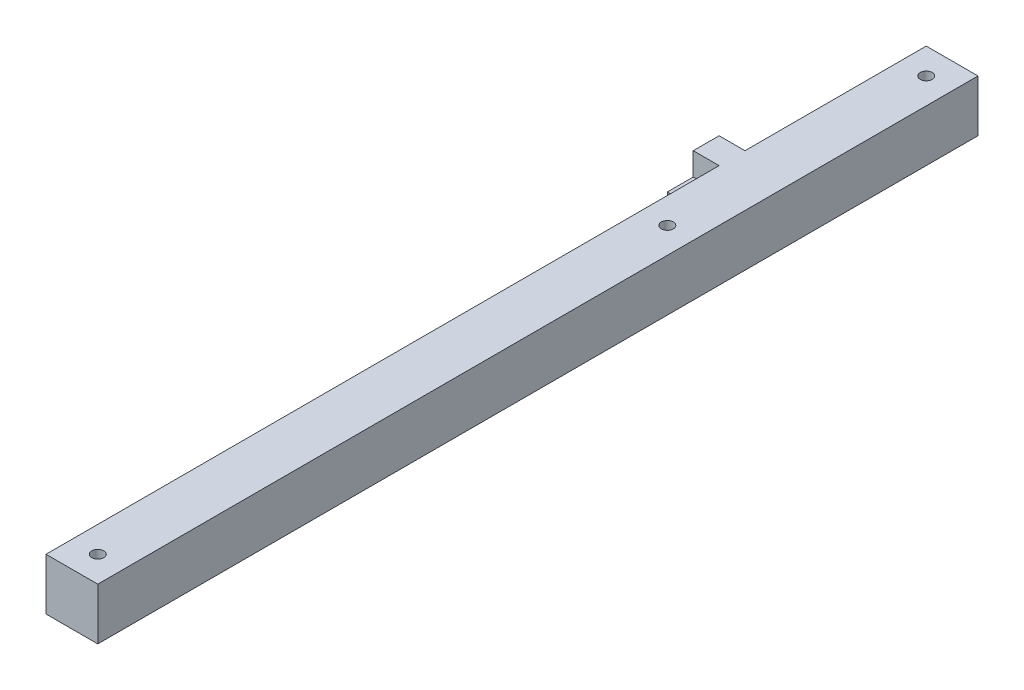
ISO-10303-21;
HEADER;
FILE_DESCRIPTION(('STEP AP214'),'2;1');
FILE_NAME('part.step','',(''),(''),'','','');
FILE_SCHEMA(('AUTOMOTIVE_DESIGN { 1 0 10303 214 1 1 1 1 }'));
ENDSEC;
DATA;
#1=APPLICATION_CONTEXT('core data for automotive mechanical design processes');
#2=APPLICATION_PROTOCOL_DEFINITION('international standard','automotive_design',2000,#1);
#3=PRODUCT_CONTEXT('',#1,'mechanical');
#4=PRODUCT('Part','Part','',(#3));
#5=PRODUCT_RELATED_PRODUCT_CATEGORY('part','',(#4));
#6=PRODUCT_DEFINITION_FORMATION('','',#4);
#7=PRODUCT_DEFINITION_CONTEXT('part definition',#1,'design');
#8=PRODUCT_DEFINITION('design','',#6,#7);
#9=PRODUCT_DEFINITION_SHAPE('','',#8);
#10=(LENGTH_UNIT() NAMED_UNIT(*) SI_UNIT(.MILLI.,.METRE.));
#11=(NAMED_UNIT(*) PLANE_ANGLE_UNIT() SI_UNIT($,.RADIAN.));
#12=(NAMED_UNIT(*) SI_UNIT($,.STERADIAN.) SOLID_ANGLE_UNIT());
#13=UNCERTAINTY_MEASURE_WITH_UNIT(LENGTH_MEASURE(1.E-05),#10,'distance_accuracy_value','');
#14=(GEOMETRIC_REPRESENTATION_CONTEXT(3) GLOBAL_UNCERTAINTY_ASSIGNED_CONTEXT((#13)) GLOBAL_UNIT_ASSIGNED_CONTEXT((#10,
#11,#12)) REPRESENTATION_CONTEXT('',''));
#15=CARTESIAN_POINT('',(0.,0.,0.));
#16=DIRECTION('',(0.,0.,1.));
#17=DIRECTION('',(1.,0.,0.));
#18=AXIS2_PLACEMENT_3D('',#15,#16,#17);
#19=CARTESIAN_POINT('',(-12.7,12.7,12.7));
#20=DIRECTION('',(1.,0.,0.));
#21=DIRECTION('',(0.,0.,-1.));
#22=AXIS2_PLACEMENT_3D('',#19,#20,#21);
#23=PLANE('',#22);
#24=DIRECTION('',(0.,1.,0.));
#25=VECTOR('',#24,1.);
#26=CARTESIAN_POINT('',(-12.7,0.,-146.05));
#27=LINE('',#26,#25);
#28=CARTESIAN_POINT('',(-12.7,0.,-146.05));
#29=VERTEX_POINT('',#28);
#30=CARTESIAN_POINT('',(-12.7,7.112,-146.05));
#31=VERTEX_POINT('',#30);
#32=EDGE_CURVE('E141',#29,#31,#27,.T.);
#33=ORIENTED_EDGE('',*,*,#32,.F.);
#34=DIRECTION('',(0.,0.,1.));
#35=VECTOR('',#34,1.);
#36=CARTESIAN_POINT('',(-12.7,0.,12.7));
#37=LINE('',#36,#35);
#38=CARTESIAN_POINT('',(-12.7,0.,12.7));
#39=VERTEX_POINT('',#38);
#40=EDGE_CURVE('E130',#29,#39,#37,.T.);
#41=ORIENTED_EDGE('',*,*,#40,.T.);
#42=DIRECTION('',(0.,-1.,0.));
#43=VECTOR('',#42,1.);
#44=CARTESIAN_POINT('',(-12.7,12.7,12.7));
#45=LINE('',#44,#43);
#46=CARTESIAN_POINT('',(-12.7,12.7,12.7));
#47=VERTEX_POINT('',#46);
#48=EDGE_CURVE('E11',#47,#39,#45,.T.);
#49=ORIENTED_EDGE('',*,*,#48,.F.);
#50=DIRECTION('',(0.,0.,1.));
#51=VECTOR('',#50,1.);
#52=CARTESIAN_POINT('',(-12.7,12.7,12.7));
#53=LINE('',#52,#51);
#54=CARTESIAN_POINT('',(-12.7,12.7,-152.4));
#55=VERTEX_POINT('',#54);
#56=EDGE_CURVE('E185',#55,#47,#53,.T.);
#57=ORIENTED_EDGE('',*,*,#56,.F.);
#58=DIRECTION('',(0.,1.,0.));
#59=VECTOR('',#58,1.);
#60=CARTESIAN_POINT('',(-12.7,0.,-152.4));
#61=LINE('',#60,#59);
#62=CARTESIAN_POINT('',(-12.7,7.112,-152.4));
#63=VERTEX_POINT('',#62);
#64=EDGE_CURVE('E56',#63,#55,#61,.T.);
#65=ORIENTED_EDGE('',*,*,#64,.F.);
#66=DIRECTION('',(0.,0.,-1.));
#67=VECTOR('',#66,1.);
#68=CARTESIAN_POINT('',(-12.7,7.112,-152.4));
#69=LINE('',#68,#67);
#70=EDGE_CURVE('E138',#31,#63,#69,.T.);
#71=ORIENTED_EDGE('',*,*,#70,.F.);
#72=EDGE_LOOP('',(#33,#41,#49,#57,#65,#71));
#73=FACE_BOUND('',#72,.T.);
#74=ADVANCED_FACE('F35',(#73),#23,.F.);
#75=CARTESIAN_POINT('',(-19.05,0.,-152.4));
#76=DIRECTION('',(0.,0.,-1.));
#77=DIRECTION('',(-1.,0.,0.));
#78=AXIS2_PLACEMENT_3D('',#75,#76,#77);
#79=PLANE('',#78);
#80=DIRECTION('',(1.,0.,0.));
#81=VECTOR('',#80,1.);
#82=CARTESIAN_POINT('',(-19.05,7.112,-152.4));
#83=LINE('',#82,#81);
#84=CARTESIAN_POINT('',(-19.05,7.112,-152.4));
#85=VERTEX_POINT('',#84);
#86=EDGE_CURVE('E49',#85,#63,#83,.T.);
#87=ORIENTED_EDGE('',*,*,#86,.T.);
#88=ORIENTED_EDGE('',*,*,#64,.T.);
#89=DIRECTION('',(1.,0.,0.));
#90=VECTOR('',#89,1.);
#91=CARTESIAN_POINT('',(-19.05,12.7,-152.4));
#92=LINE('',#91,#90);
#93=CARTESIAN_POINT('',(-19.05,12.7,-152.4));
#94=VERTEX_POINT('',#93);
#95=EDGE_CURVE('E160',#94,#55,#92,.T.);
#96=ORIENTED_EDGE('',*,*,#95,.F.);
#97=DIRECTION('',(0.,1.,0.));
#98=VECTOR('',#97,1.);
#99=CARTESIAN_POINT('',(-19.05,0.,-152.4));
#100=LINE('',#99,#98);
#101=EDGE_CURVE('E147',#85,#94,#100,.T.);
#102=ORIENTED_EDGE('',*,*,#101,.F.);
#103=EDGE_LOOP('',(#87,#88,#96,#102));
#104=FACE_BOUND('',#103,.T.);
#105=ADVANCED_FACE('F241',(#104),#79,.F.);
#106=DIRECTION('',(0.,-1.,0.));
#107=VECTOR('',#106,1.);
#108=CARTESIAN_POINT('',(-12.7,0.,-158.75));
#109=LINE('',#108,#107);
#110=CARTESIAN_POINT('',(-12.7,12.7,-158.75));
#111=VERTEX_POINT('',#110);
#112=CARTESIAN_POINT('',(-12.7,0.,-158.75));
#113=VERTEX_POINT('',#112);
#114=EDGE_CURVE('E150',#111,#113,#109,.T.);
#115=ORIENTED_EDGE('',*,*,#114,.F.);
#116=CARTESIAN_POINT('',(-12.7,12.7,-203.2));
#117=VERTEX_POINT('',#116);
#118=EDGE_CURVE('E181',#117,#111,#53,.T.);
#119=ORIENTED_EDGE('',*,*,#118,.F.);
#120=DIRECTION('',(0.,-1.,0.));
#121=VECTOR('',#120,1.);
#122=CARTESIAN_POINT('',(-12.7,12.7,-203.2));
#123=LINE('',#122,#121);
#124=CARTESIAN_POINT('',(-12.7,0.,-203.2));
#125=VERTEX_POINT('',#124);
#126=EDGE_CURVE('E191',#117,#125,#123,.T.);
#127=ORIENTED_EDGE('',*,*,#126,.T.);
#128=EDGE_CURVE('E192',#125,#113,#37,.T.);
#129=ORIENTED_EDGE('',*,*,#128,.T.);
#130=EDGE_LOOP('',(#115,#119,#127,#129));
#131=FACE_BOUND('',#130,.T.);
#132=ADVANCED_FACE('F221',(#131),#23,.F.);
#133=CARTESIAN_POINT('',(-12.7,12.7,12.7));
#134=DIRECTION('',(0.,0.,-1.));
#135=DIRECTION('',(-1.,0.,0.));
#136=AXIS2_PLACEMENT_3D('',#133,#134,#135);
#137=PLANE('',#136);
#138=DIRECTION('',(1.,0.,0.));
#139=VECTOR('',#138,1.);
#140=CARTESIAN_POINT('',(-12.7,0.,12.7));
#141=LINE('',#140,#139);
#142=CARTESIAN_POINT('',(0.,0.,12.7));
#143=VERTEX_POINT('',#142);
#144=EDGE_CURVE('E194',#39,#143,#141,.T.);
#145=ORIENTED_EDGE('',*,*,#144,.T.);
#146=DIRECTION('',(0.,-1.,0.));
#147=VECTOR('',#146,1.);
#148=CARTESIAN_POINT('',(0.,12.7,12.7));
#149=LINE('',#148,#147);
#150=CARTESIAN_POINT('',(0.,12.7,12.7));
#151=VERTEX_POINT('',#150);
#152=EDGE_CURVE('E42',#151,#143,#149,.T.);
#153=ORIENTED_EDGE('',*,*,#152,.F.);
#154=DIRECTION('',(1.,0.,0.));
#155=VECTOR('',#154,1.);
#156=CARTESIAN_POINT('',(-12.7,12.7,12.7));
#157=LINE('',#156,#155);
#158=EDGE_CURVE('E184',#47,#151,#157,.T.);
#159=ORIENTED_EDGE('',*,*,#158,.F.);
#160=ORIENTED_EDGE('',*,*,#48,.T.);
#161=EDGE_LOOP('',(#145,#153,#159,#160));
#162=FACE_BOUND('',#161,.T.);
#163=ADVANCED_FACE('F247',(#162),#137,.F.);
#164=CARTESIAN_POINT('',(0.,12.7,12.7));
#165=DIRECTION('',(-1.,0.,0.));
#166=DIRECTION('',(0.,0.,1.));
#167=AXIS2_PLACEMENT_3D('',#164,#165,#166);
#168=PLANE('',#167);
#169=DIRECTION('',(0.,0.,-1.));
#170=VECTOR('',#169,1.);
#171=CARTESIAN_POINT('',(0.,0.,12.7));
#172=LINE('',#171,#170);
#173=CARTESIAN_POINT('',(0.,0.,-203.2));
#174=VERTEX_POINT('',#173);
#175=EDGE_CURVE('E196',#143,#174,#172,.T.);
#176=ORIENTED_EDGE('',*,*,#175,.T.);
#177=DIRECTION('',(0.,-1.,0.));
#178=VECTOR('',#177,1.);
#179=CARTESIAN_POINT('',(0.,12.7,-203.2));
#180=LINE('',#179,#178);
#181=CARTESIAN_POINT('',(0.,12.7,-203.2));
#182=VERTEX_POINT('',#181);
#183=EDGE_CURVE('E202',#182,#174,#180,.T.);
#184=ORIENTED_EDGE('',*,*,#183,.F.);
#185=DIRECTION('',(0.,0.,-1.));
#186=VECTOR('',#185,1.);
#187=CARTESIAN_POINT('',(0.,12.7,12.7));
#188=LINE('',#187,#186);
#189=EDGE_CURVE('E187',#151,#182,#188,.T.);
#190=ORIENTED_EDGE('',*,*,#189,.F.);
#191=ORIENTED_EDGE('',*,*,#152,.T.);
#192=EDGE_LOOP('',(#176,#184,#190,#191));
#193=FACE_BOUND('',#192,.T.);
#194=ADVANCED_FACE('F209',(#193),#168,.F.);
#195=CARTESIAN_POINT('',(-12.7,12.7,-203.2));
#196=DIRECTION('',(0.,0.,1.));
#197=DIRECTION('',(1.,0.,0.));
#198=AXIS2_PLACEMENT_3D('',#195,#196,#197);
#199=PLANE('',#198);
#200=DIRECTION('',(-1.,0.,0.));
#201=VECTOR('',#200,1.);
#202=CARTESIAN_POINT('',(-12.7,0.,-203.2));
#203=LINE('',#202,#201);
#204=EDGE_CURVE('E198',#174,#125,#203,.T.);
#205=ORIENTED_EDGE('',*,*,#204,.T.);
#206=ORIENTED_EDGE('',*,*,#126,.F.);
#207=DIRECTION('',(-1.,0.,0.));
#208=VECTOR('',#207,1.);
#209=CARTESIAN_POINT('',(-12.7,12.7,-203.2));
#210=LINE('',#209,#208);
#211=EDGE_CURVE('E189',#182,#117,#210,.T.);
#212=ORIENTED_EDGE('',*,*,#211,.F.);
#213=ORIENTED_EDGE('',*,*,#183,.T.);
#214=EDGE_LOOP('',(#205,#206,#212,#213));
#215=FACE_BOUND('',#214,.T.);
#216=ADVANCED_FACE('F217',(#215),#199,.F.);
#217=CARTESIAN_POINT('',(0.,12.7,0.));
#218=DIRECTION('',(0.,-1.,0.));
#219=DIRECTION('',(0.,0.,-1.));
#220=AXIS2_PLACEMENT_3D('',#217,#218,#219);
#221=PLANE('',#220);
#222=CARTESIAN_POINT('',(-6.35,12.7,-196.85));
#223=DIRECTION('',(0.,1.,0.));
#224=DIRECTION('',(0.,0.,1.));
#225=AXIS2_PLACEMENT_3D('',#222,#223,#224);
#226=CIRCLE('',#225,1.47319999999999);
#227=CARTESIAN_POINT('',(-6.35,12.7,-195.3768));
#228=VERTEX_POINT('',#227);
#229=EDGE_CURVE('E163',#228,#228,#226,.T.);
#230=ORIENTED_EDGE('',*,*,#229,.F.);
#231=EDGE_LOOP('',(#230));
#232=FACE_BOUND('',#231,.T.);
#233=CARTESIAN_POINT('',(-6.35,12.7,-133.35));
#234=DIRECTION('',(0.,1.,0.));
#235=DIRECTION('',(0.,0.,1.));
#236=AXIS2_PLACEMENT_3D('',#233,#234,#235);
#237=CIRCLE('',#236,1.47319999999999);
#238=CARTESIAN_POINT('',(-6.35,12.7,-131.8768));
#239=VERTEX_POINT('',#238);
#240=EDGE_CURVE('E169',#239,#239,#237,.T.);
#241=ORIENTED_EDGE('',*,*,#240,.F.);
#242=EDGE_LOOP('',(#241));
#243=FACE_BOUND('',#242,.T.);
#244=CARTESIAN_POINT('',(-6.35,12.7,6.35));
#245=DIRECTION('',(0.,1.,0.));
#246=DIRECTION('',(0.,0.,1.));
#247=AXIS2_PLACEMENT_3D('',#244,#245,#246);
#248=CIRCLE('',#247,1.47319999999999);
#249=CARTESIAN_POINT('',(-6.35,12.7,7.82319999999999));
#250=VERTEX_POINT('',#249);
#251=EDGE_CURVE('E175',#250,#250,#248,.T.);
#252=ORIENTED_EDGE('',*,*,#251,.F.);
#253=EDGE_LOOP('',(#252));
#254=FACE_BOUND('',#253,.T.);
#255=ORIENTED_EDGE('',*,*,#118,.T.);
#256=DIRECTION('',(1.,0.,0.));
#257=VECTOR('',#256,1.);
#258=CARTESIAN_POINT('',(-19.05,12.7,-158.75));
#259=LINE('',#258,#257);
#260=CARTESIAN_POINT('',(-19.05,12.7,-158.75));
#261=VERTEX_POINT('',#260);
#262=EDGE_CURVE('E157',#261,#111,#259,.T.);
#263=ORIENTED_EDGE('',*,*,#262,.F.);
#264=DIRECTION('',(0.,0.,-1.));
#265=VECTOR('',#264,1.);
#266=CARTESIAN_POINT('',(-19.05,12.7,-152.4));
#267=LINE('',#266,#265);
#268=EDGE_CURVE('E149',#94,#261,#267,.T.);
#269=ORIENTED_EDGE('',*,*,#268,.F.);
#270=ORIENTED_EDGE('',*,*,#95,.T.);
#271=ORIENTED_EDGE('',*,*,#56,.T.);
#272=ORIENTED_EDGE('',*,*,#158,.T.);
#273=ORIENTED_EDGE('',*,*,#189,.T.);
#274=ORIENTED_EDGE('',*,*,#211,.T.);
#275=EDGE_LOOP('',(#255,#263,#269,#270,#271,#272,#273,#274));
#276=FACE_BOUND('',#275,.T.);
#277=ADVANCED_FACE('F224',(#232,#243,#254,#276),#221,.F.);
#278=CARTESIAN_POINT('',(0.,0.,0.));
#279=DIRECTION('',(0.,-1.,0.));
#280=DIRECTION('',(0.,0.,-1.));
#281=AXIS2_PLACEMENT_3D('',#278,#279,#280);
#282=PLANE('',#281);
#283=ORIENTED_EDGE('',*,*,#40,.F.);
#284=DIRECTION('',(1.,0.,0.));
#285=VECTOR('',#284,1.);
#286=CARTESIAN_POINT('',(-19.05,0.,-146.05));
#287=LINE('',#286,#285);
#288=CARTESIAN_POINT('',(-19.05,0.,-146.05));
#289=VERTEX_POINT('',#288);
#290=EDGE_CURVE('E126',#289,#29,#287,.T.);
#291=ORIENTED_EDGE('',*,*,#290,.F.);
#292=DIRECTION('',(0.,0.,1.));
#293=VECTOR('',#292,1.);
#294=CARTESIAN_POINT('',(-19.05,0.,-152.4));
#295=LINE('',#294,#293);
#296=CARTESIAN_POINT('',(-19.05,0.,-158.75));
#297=VERTEX_POINT('',#296);
#298=EDGE_CURVE('E112',#297,#289,#295,.T.);
#299=ORIENTED_EDGE('',*,*,#298,.F.);
#300=DIRECTION('',(1.,0.,0.));
#301=VECTOR('',#300,1.);
#302=CARTESIAN_POINT('',(-19.05,0.,-158.75));
#303=LINE('',#302,#301);
#304=EDGE_CURVE('E123',#297,#113,#303,.T.);
#305=ORIENTED_EDGE('',*,*,#304,.T.);
#306=ORIENTED_EDGE('',*,*,#128,.F.);
#307=ORIENTED_EDGE('',*,*,#204,.F.);
#308=ORIENTED_EDGE('',*,*,#175,.F.);
#309=ORIENTED_EDGE('',*,*,#144,.F.);
#310=EDGE_LOOP('',(#283,#291,#299,#305,#306,#307,#308,#309));
#311=FACE_BOUND('',#310,.T.);
#312=CARTESIAN_POINT('',(-6.35,0.,-196.85));
#313=DIRECTION('',(0.,1.,0.));
#314=DIRECTION('',(0.,0.,1.));
#315=AXIS2_PLACEMENT_3D('',#312,#313,#314);
#316=CIRCLE('',#315,1.4732);
#317=CARTESIAN_POINT('',(-6.35,0.,-195.3768));
#318=VERTEX_POINT('',#317);
#319=EDGE_CURVE('E166',#318,#318,#316,.T.);
#320=ORIENTED_EDGE('',*,*,#319,.T.);
#321=EDGE_LOOP('',(#320));
#322=FACE_BOUND('',#321,.T.);
#323=CARTESIAN_POINT('',(-6.35,0.,-133.35));
#324=DIRECTION('',(0.,1.,0.));
#325=DIRECTION('',(0.,0.,1.));
#326=AXIS2_PLACEMENT_3D('',#323,#324,#325);
#327=CIRCLE('',#326,1.4732);
#328=CARTESIAN_POINT('',(-6.35,0.,-131.8768));
#329=VERTEX_POINT('',#328);
#330=EDGE_CURVE('E172',#329,#329,#327,.T.);
#331=ORIENTED_EDGE('',*,*,#330,.T.);
#332=EDGE_LOOP('',(#331));
#333=FACE_BOUND('',#332,.T.);
#334=CARTESIAN_POINT('',(-6.35,0.,6.35));
#335=DIRECTION('',(0.,1.,0.));
#336=DIRECTION('',(0.,0.,1.));
#337=AXIS2_PLACEMENT_3D('',#334,#335,#336);
#338=CIRCLE('',#337,1.4732);
#339=CARTESIAN_POINT('',(-6.35,0.,7.8232));
#340=VERTEX_POINT('',#339);
#341=EDGE_CURVE('E178',#340,#340,#338,.T.);
#342=ORIENTED_EDGE('',*,*,#341,.T.);
#343=EDGE_LOOP('',(#342));
#344=FACE_BOUND('',#343,.T.);
#345=ADVANCED_FACE('F127',(#311,#322,#333,#344),#282,.T.);
#346=CARTESIAN_POINT('',(-6.35,12.7,6.35));
#347=DIRECTION('',(0.,1.,0.));
#348=DIRECTION('',(0.,0.,1.));
#349=AXIS2_PLACEMENT_3D('',#346,#347,#348);
#350=CYLINDRICAL_SURFACE('',#349,1.47319999999999);
#351=ORIENTED_EDGE('',*,*,#341,.F.);
#352=EDGE_LOOP('',(#351));
#353=FACE_BOUND('',#352,.T.);
#354=ORIENTED_EDGE('',*,*,#251,.T.);
#355=EDGE_LOOP('',(#354));
#356=FACE_BOUND('',#355,.T.);
#357=ADVANCED_FACE('F260',(#353,#356),#350,.F.);
#358=CARTESIAN_POINT('',(-6.35,12.7,-133.35));
#359=DIRECTION('',(0.,1.,0.));
#360=DIRECTION('',(0.,0.,1.));
#361=AXIS2_PLACEMENT_3D('',#358,#359,#360);
#362=CYLINDRICAL_SURFACE('',#361,1.47319999999999);
#363=ORIENTED_EDGE('',*,*,#330,.F.);
#364=EDGE_LOOP('',(#363));
#365=FACE_BOUND('',#364,.T.);
#366=ORIENTED_EDGE('',*,*,#240,.T.);
#367=EDGE_LOOP('',(#366));
#368=FACE_BOUND('',#367,.T.);
#369=ADVANCED_FACE('F236',(#365,#368),#362,.F.);
#370=CARTESIAN_POINT('',(-6.35,12.7,-196.85));
#371=DIRECTION('',(0.,1.,0.));
#372=DIRECTION('',(0.,0.,1.));
#373=AXIS2_PLACEMENT_3D('',#370,#371,#372);
#374=CYLINDRICAL_SURFACE('',#373,1.47319999999999);
#375=ORIENTED_EDGE('',*,*,#319,.F.);
#376=EDGE_LOOP('',(#375));
#377=FACE_BOUND('',#376,.T.);
#378=ORIENTED_EDGE('',*,*,#229,.T.);
#379=EDGE_LOOP('',(#378));
#380=FACE_BOUND('',#379,.T.);
#381=ADVANCED_FACE('F229',(#377,#380),#374,.F.);
#382=CARTESIAN_POINT('',(-19.05,0.,-158.75));
#383=DIRECTION('',(0.,0.,1.));
#384=DIRECTION('',(1.,0.,0.));
#385=AXIS2_PLACEMENT_3D('',#382,#383,#384);
#386=PLANE('',#385);
#387=ORIENTED_EDGE('',*,*,#114,.T.);
#388=ORIENTED_EDGE('',*,*,#304,.F.);
#389=DIRECTION('',(0.,-1.,0.));
#390=VECTOR('',#389,1.);
#391=CARTESIAN_POINT('',(-19.05,0.,-158.75));
#392=LINE('',#391,#390);
#393=EDGE_CURVE('E119',#261,#297,#392,.T.);
#394=ORIENTED_EDGE('',*,*,#393,.F.);
#395=ORIENTED_EDGE('',*,*,#262,.T.);
#396=EDGE_LOOP('',(#387,#388,#394,#395));
#397=FACE_BOUND('',#396,.T.);
#398=ADVANCED_FACE('F227',(#397),#386,.F.);
#399=CARTESIAN_POINT('',(-19.05,0.,0.));
#400=DIRECTION('',(-1.,0.,0.));
#401=DIRECTION('',(0.,0.,1.));
#402=AXIS2_PLACEMENT_3D('',#399,#400,#401);
#403=PLANE('',#402);
#404=ORIENTED_EDGE('',*,*,#298,.T.);
#405=DIRECTION('',(0.,1.,0.));
#406=VECTOR('',#405,1.);
#407=CARTESIAN_POINT('',(-19.05,0.,-146.05));
#408=LINE('',#407,#406);
#409=CARTESIAN_POINT('',(-19.05,7.112,-146.05));
#410=VERTEX_POINT('',#409);
#411=EDGE_CURVE('E116',#289,#410,#408,.T.);
#412=ORIENTED_EDGE('',*,*,#411,.T.);
#413=DIRECTION('',(0.,0.,-1.));
#414=VECTOR('',#413,1.);
#415=CARTESIAN_POINT('',(-19.05,7.112,-152.4));
#416=LINE('',#415,#414);
#417=EDGE_CURVE('E137',#410,#85,#416,.T.);
#418=ORIENTED_EDGE('',*,*,#417,.T.);
#419=ORIENTED_EDGE('',*,*,#101,.T.);
#420=ORIENTED_EDGE('',*,*,#268,.T.);
#421=ORIENTED_EDGE('',*,*,#393,.T.);
#422=EDGE_LOOP('',(#404,#412,#418,#419,#420,#421));
#423=FACE_BOUND('',#422,.T.);
#424=ADVANCED_FACE('F114',(#423),#403,.T.);
#425=CARTESIAN_POINT('',(-19.05,0.,-146.05));
#426=DIRECTION('',(0.,0.,-1.));
#427=DIRECTION('',(-1.,0.,0.));
#428=AXIS2_PLACEMENT_3D('',#425,#426,#427);
#429=PLANE('',#428);
#430=ORIENTED_EDGE('',*,*,#32,.T.);
#431=DIRECTION('',(1.,0.,0.));
#432=VECTOR('',#431,1.);
#433=CARTESIAN_POINT('',(-19.05,7.112,-146.05));
#434=LINE('',#433,#432);
#435=EDGE_CURVE('E133',#410,#31,#434,.T.);
#436=ORIENTED_EDGE('',*,*,#435,.F.);
#437=ORIENTED_EDGE('',*,*,#411,.F.);
#438=ORIENTED_EDGE('',*,*,#290,.T.);
#439=EDGE_LOOP('',(#430,#436,#437,#438));
#440=FACE_BOUND('',#439,.T.);
#441=ADVANCED_FACE('F135',(#440),#429,.F.);
#442=CARTESIAN_POINT('',(-19.05,7.112,-152.4));
#443=DIRECTION('',(0.,-1.,0.));
#444=DIRECTION('',(0.,0.,-1.));
#445=AXIS2_PLACEMENT_3D('',#442,#443,#444);
#446=PLANE('',#445);
#447=ORIENTED_EDGE('',*,*,#70,.T.);
#448=ORIENTED_EDGE('',*,*,#86,.F.);
#449=ORIENTED_EDGE('',*,*,#417,.F.);
#450=ORIENTED_EDGE('',*,*,#435,.T.);
#451=EDGE_LOOP('',(#447,#448,#449,#450));
#452=FACE_BOUND('',#451,.T.);
#453=ADVANCED_FACE('F335',(#452),#446,.F.);
#454=CLOSED_SHELL('',(#74,#105,#132,#163,#194,#216,#277,#345,#357,#369,#381,#398,#424,#441,#453));
#455=MANIFOLD_SOLID_BREP('B2',#454);
#456=ADVANCED_BREP_SHAPE_REPRESENTATION('',(#18,#455),#14);
#457=SHAPE_DEFINITION_REPRESENTATION(#9,#456);
ENDSEC;
END-ISO-10303-21;
